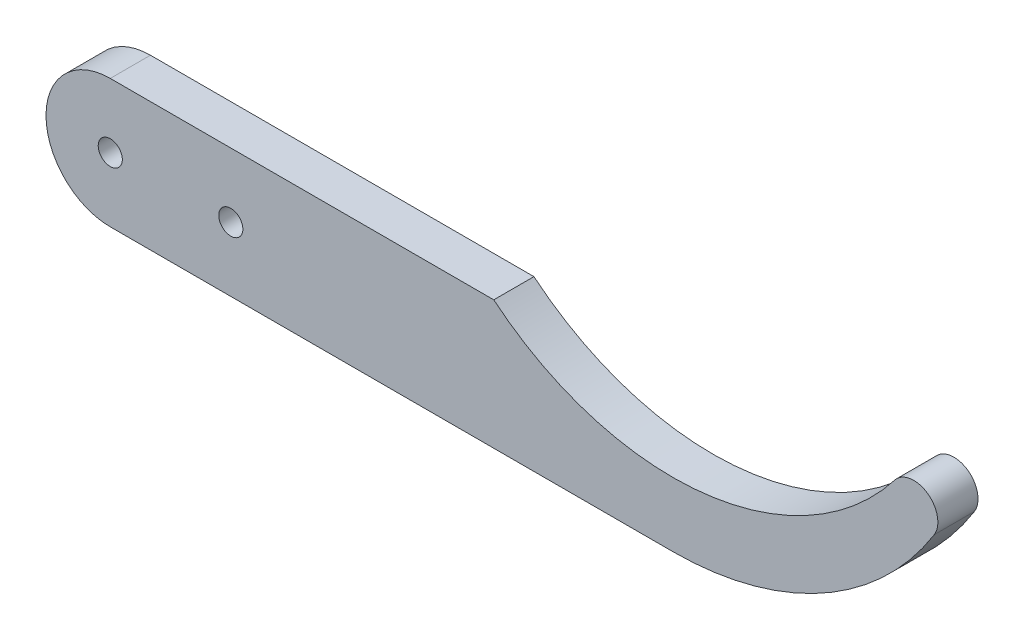
ISO-10303-21;
HEADER;
FILE_DESCRIPTION(('STEP AP214'),'2;1');
FILE_NAME('part.step','',(''),(''),'','','');
FILE_SCHEMA(('AUTOMOTIVE_DESIGN { 1 0 10303 214 1 1 1 1 }'));
ENDSEC;
DATA;
#1=APPLICATION_CONTEXT('core data for automotive mechanical design processes');
#2=APPLICATION_PROTOCOL_DEFINITION('international standard','automotive_design',2000,#1);
#3=PRODUCT_CONTEXT('',#1,'mechanical');
#4=PRODUCT('Part','Part','',(#3));
#5=PRODUCT_RELATED_PRODUCT_CATEGORY('part','',(#4));
#6=PRODUCT_DEFINITION_FORMATION('','',#4);
#7=PRODUCT_DEFINITION_CONTEXT('part definition',#1,'design');
#8=PRODUCT_DEFINITION('design','',#6,#7);
#9=PRODUCT_DEFINITION_SHAPE('','',#8);
#10=(LENGTH_UNIT() NAMED_UNIT(*) SI_UNIT(.MILLI.,.METRE.));
#11=(NAMED_UNIT(*) PLANE_ANGLE_UNIT() SI_UNIT($,.RADIAN.));
#12=(NAMED_UNIT(*) SI_UNIT($,.STERADIAN.) SOLID_ANGLE_UNIT());
#13=UNCERTAINTY_MEASURE_WITH_UNIT(LENGTH_MEASURE(1.E-05),#10,'distance_accuracy_value','');
#14=(GEOMETRIC_REPRESENTATION_CONTEXT(3) GLOBAL_UNCERTAINTY_ASSIGNED_CONTEXT((#13)) GLOBAL_UNIT_ASSIGNED_CONTEXT((#10,
#11,#12)) REPRESENTATION_CONTEXT('',''));
#15=CARTESIAN_POINT('',(0.,0.,0.));
#16=DIRECTION('',(0.,0.,1.));
#17=DIRECTION('',(1.,0.,0.));
#18=AXIS2_PLACEMENT_3D('',#15,#16,#17);
#19=CARTESIAN_POINT('',(-15.,0.,5.));
#20=DIRECTION('',(0.,0.,1.));
#21=DIRECTION('',(1.,0.,0.));
#22=AXIS2_PLACEMENT_3D('',#19,#20,#21);
#23=PLANE('',#22);
#24=CARTESIAN_POINT('',(0.,0.,5.));
#25=DIRECTION('',(0.,0.,1.));
#26=DIRECTION('',(1.,0.,0.));
#27=AXIS2_PLACEMENT_3D('',#24,#25,#26);
#28=CIRCLE('',#27,1.5);
#29=CARTESIAN_POINT('',(1.5,0.,5.));
#30=VERTEX_POINT('',#29);
#31=EDGE_CURVE('E127',#30,#30,#28,.T.);
#32=ORIENTED_EDGE('',*,*,#31,.F.);
#33=EDGE_LOOP('',(#32));
#34=FACE_BOUND('',#33,.T.);
#35=DIRECTION('',(-1.,0.,0.));
#36=VECTOR('',#35,1.);
#37=CARTESIAN_POINT('',(0.,8.,5.));
#38=LINE('',#37,#36);
#39=CARTESIAN_POINT('',(32.7289425486799,8.,5.));
#40=VERTEX_POINT('',#39);
#41=CARTESIAN_POINT('',(-15.,8.,5.));
#42=VERTEX_POINT('',#41);
#43=EDGE_CURVE('E50',#40,#42,#38,.T.);
#44=ORIENTED_EDGE('',*,*,#43,.T.);
#45=CARTESIAN_POINT('',(-15.,0.,5.));
#46=DIRECTION('',(0.,0.,1.));
#47=DIRECTION('',(1.,0.,0.));
#48=AXIS2_PLACEMENT_3D('',#45,#46,#47);
#49=CIRCLE('',#48,8.);
#50=CARTESIAN_POINT('',(-15.,-8.,5.));
#51=VERTEX_POINT('',#50);
#52=EDGE_CURVE('E89',#42,#51,#49,.T.);
#53=ORIENTED_EDGE('',*,*,#52,.T.);
#54=DIRECTION('',(1.,0.,0.));
#55=VECTOR('',#54,1.);
#56=CARTESIAN_POINT('',(0.,-8.,5.));
#57=LINE('',#56,#55);
#58=CARTESIAN_POINT('',(55.,-8.,5.));
#59=VERTEX_POINT('',#58);
#60=EDGE_CURVE('E103',#51,#59,#57,.T.);
#61=ORIENTED_EDGE('',*,*,#60,.T.);
#62=CARTESIAN_POINT('',(55.,30.3226733037957,5.));
#63=DIRECTION('',(0.,0.,1.));
#64=DIRECTION('',(1.,0.,0.));
#65=AXIS2_PLACEMENT_3D('',#62,#63,#64);
#66=CIRCLE('',#65,38.3226733037957);
#67=CARTESIAN_POINT('',(87.5479385216953,10.0925228560754,5.));
#68=VERTEX_POINT('',#67);
#69=EDGE_CURVE('E97',#59,#68,#66,.T.);
#70=ORIENTED_EDGE('',*,*,#69,.T.);
#71=CARTESIAN_POINT('',(85.,11.6761924206188,5.));
#72=DIRECTION('',(0.,0.,1.));
#73=DIRECTION('',(-1.,0.,0.));
#74=AXIS2_PLACEMENT_3D('',#71,#72,#73);
#75=CIRCLE('',#74,3.);
#76=CARTESIAN_POINT('',(82.6315789473684,13.5175456505699,5.));
#77=VERTEX_POINT('',#76);
#78=EDGE_CURVE('E101',#68,#77,#75,.T.);
#79=ORIENTED_EDGE('',*,*,#78,.T.);
#80=CARTESIAN_POINT('',(55.,35.,5.));
#81=DIRECTION('',(0.,0.,-1.));
#82=DIRECTION('',(1.,0.,0.));
#83=AXIS2_PLACEMENT_3D('',#80,#81,#82);
#84=CIRCLE('',#83,35.);
#85=EDGE_CURVE('E117',#77,#40,#84,.T.);
#86=ORIENTED_EDGE('',*,*,#85,.T.);
#87=EDGE_LOOP('',(#44,#53,#61,#70,#79,#86));
#88=FACE_BOUND('',#87,.T.);
#89=CARTESIAN_POINT('',(-15.,0.,5.));
#90=DIRECTION('',(0.,0.,1.));
#91=DIRECTION('',(1.,0.,0.));
#92=AXIS2_PLACEMENT_3D('',#89,#90,#91);
#93=CIRCLE('',#92,1.5);
#94=CARTESIAN_POINT('',(-13.5,0.,5.));
#95=VERTEX_POINT('',#94);
#96=EDGE_CURVE('E173',#95,#95,#93,.T.);
#97=ORIENTED_EDGE('',*,*,#96,.F.);
#98=EDGE_LOOP('',(#97));
#99=FACE_BOUND('',#98,.T.);
#100=ADVANCED_FACE('F33',(#34,#88,#99),#23,.T.);
#101=CARTESIAN_POINT('',(-15.,0.,0.));
#102=DIRECTION('',(0.,0.,1.));
#103=DIRECTION('',(1.,0.,0.));
#104=AXIS2_PLACEMENT_3D('',#101,#102,#103);
#105=PLANE('',#104);
#106=CARTESIAN_POINT('',(0.,0.,0.));
#107=DIRECTION('',(0.,0.,1.));
#108=DIRECTION('',(1.,0.,0.));
#109=AXIS2_PLACEMENT_3D('',#106,#107,#108);
#110=CIRCLE('',#109,1.5);
#111=CARTESIAN_POINT('',(1.5,0.,0.));
#112=VERTEX_POINT('',#111);
#113=EDGE_CURVE('E178',#112,#112,#110,.T.);
#114=ORIENTED_EDGE('',*,*,#113,.T.);
#115=EDGE_LOOP('',(#114));
#116=FACE_BOUND('',#115,.T.);
#117=CARTESIAN_POINT('',(-15.,0.,0.));
#118=DIRECTION('',(0.,0.,1.));
#119=DIRECTION('',(1.,0.,0.));
#120=AXIS2_PLACEMENT_3D('',#117,#118,#119);
#121=CIRCLE('',#120,8.);
#122=CARTESIAN_POINT('',(-15.,8.,0.));
#123=VERTEX_POINT('',#122);
#124=CARTESIAN_POINT('',(-15.,-8.,0.));
#125=VERTEX_POINT('',#124);
#126=EDGE_CURVE('E123',#123,#125,#121,.T.);
#127=ORIENTED_EDGE('',*,*,#126,.F.);
#128=DIRECTION('',(-1.,0.,0.));
#129=VECTOR('',#128,1.);
#130=CARTESIAN_POINT('',(0.,8.,0.));
#131=LINE('',#130,#129);
#132=CARTESIAN_POINT('',(32.7289425486799,8.,0.));
#133=VERTEX_POINT('',#132);
#134=EDGE_CURVE('E81',#133,#123,#131,.T.);
#135=ORIENTED_EDGE('',*,*,#134,.F.);
#136=CARTESIAN_POINT('',(55.,35.,0.));
#137=DIRECTION('',(0.,0.,-1.));
#138=DIRECTION('',(1.,0.,0.));
#139=AXIS2_PLACEMENT_3D('',#136,#137,#138);
#140=CIRCLE('',#139,35.);
#141=CARTESIAN_POINT('',(82.6315789473684,13.5175456505699,0.));
#142=VERTEX_POINT('',#141);
#143=EDGE_CURVE('E131',#142,#133,#140,.T.);
#144=ORIENTED_EDGE('',*,*,#143,.F.);
#145=CARTESIAN_POINT('',(85.,11.6761924206188,0.));
#146=DIRECTION('',(0.,0.,1.));
#147=DIRECTION('',(-1.,0.,0.));
#148=AXIS2_PLACEMENT_3D('',#145,#146,#147);
#149=CIRCLE('',#148,3.);
#150=CARTESIAN_POINT('',(87.5479385216953,10.0925228560754,0.));
#151=VERTEX_POINT('',#150);
#152=EDGE_CURVE('E74',#151,#142,#149,.T.);
#153=ORIENTED_EDGE('',*,*,#152,.F.);
#154=CARTESIAN_POINT('',(55.,30.3226733037957,0.));
#155=DIRECTION('',(0.,0.,1.));
#156=DIRECTION('',(1.,0.,0.));
#157=AXIS2_PLACEMENT_3D('',#154,#155,#156);
#158=CIRCLE('',#157,38.3226733037957);
#159=CARTESIAN_POINT('',(55.,-8.,0.));
#160=VERTEX_POINT('',#159);
#161=EDGE_CURVE('E111',#160,#151,#158,.T.);
#162=ORIENTED_EDGE('',*,*,#161,.F.);
#163=DIRECTION('',(1.,0.,0.));
#164=VECTOR('',#163,1.);
#165=CARTESIAN_POINT('',(0.,-8.,0.));
#166=LINE('',#165,#164);
#167=EDGE_CURVE('E126',#125,#160,#166,.T.);
#168=ORIENTED_EDGE('',*,*,#167,.F.);
#169=EDGE_LOOP('',(#127,#135,#144,#153,#162,#168));
#170=FACE_BOUND('',#169,.T.);
#171=CARTESIAN_POINT('',(-15.,0.,0.));
#172=DIRECTION('',(0.,0.,1.));
#173=DIRECTION('',(1.,0.,0.));
#174=AXIS2_PLACEMENT_3D('',#171,#172,#173);
#175=CIRCLE('',#174,1.5);
#176=CARTESIAN_POINT('',(-13.5,0.,0.));
#177=VERTEX_POINT('',#176);
#178=EDGE_CURVE('E176',#177,#177,#175,.T.);
#179=ORIENTED_EDGE('',*,*,#178,.T.);
#180=EDGE_LOOP('',(#179));
#181=FACE_BOUND('',#180,.T.);
#182=ADVANCED_FACE('F139',(#116,#170,#181),#105,.F.);
#183=CARTESIAN_POINT('',(-15.,0.,5.));
#184=DIRECTION('',(0.,0.,-1.));
#185=DIRECTION('',(-1.,0.,0.));
#186=AXIS2_PLACEMENT_3D('',#183,#184,#185);
#187=CYLINDRICAL_SURFACE('',#186,8.);
#188=ORIENTED_EDGE('',*,*,#126,.T.);
#189=DIRECTION('',(0.,0.,-1.));
#190=VECTOR('',#189,1.);
#191=CARTESIAN_POINT('',(-15.,-8.,5.));
#192=LINE('',#191,#190);
#193=EDGE_CURVE('E42',#51,#125,#192,.T.);
#194=ORIENTED_EDGE('',*,*,#193,.F.);
#195=ORIENTED_EDGE('',*,*,#52,.F.);
#196=DIRECTION('',(0.,0.,-1.));
#197=VECTOR('',#196,1.);
#198=CARTESIAN_POINT('',(-15.,8.,5.));
#199=LINE('',#198,#197);
#200=EDGE_CURVE('E11',#42,#123,#199,.T.);
#201=ORIENTED_EDGE('',*,*,#200,.T.);
#202=EDGE_LOOP('',(#188,#194,#195,#201));
#203=FACE_BOUND('',#202,.T.);
#204=ADVANCED_FACE('F35',(#203),#187,.T.);
#205=CARTESIAN_POINT('',(0.,-8.,5.));
#206=DIRECTION('',(0.,1.,0.));
#207=DIRECTION('',(0.,0.,1.));
#208=AXIS2_PLACEMENT_3D('',#205,#206,#207);
#209=PLANE('',#208);
#210=ORIENTED_EDGE('',*,*,#167,.T.);
#211=DIRECTION('',(0.,0.,-1.));
#212=VECTOR('',#211,1.);
#213=CARTESIAN_POINT('',(55.,-8.,5.));
#214=LINE('',#213,#212);
#215=EDGE_CURVE('E112',#59,#160,#214,.T.);
#216=ORIENTED_EDGE('',*,*,#215,.F.);
#217=ORIENTED_EDGE('',*,*,#60,.F.);
#218=ORIENTED_EDGE('',*,*,#193,.T.);
#219=EDGE_LOOP('',(#210,#216,#217,#218));
#220=FACE_BOUND('',#219,.T.);
#221=ADVANCED_FACE('F138',(#220),#209,.F.);
#222=CARTESIAN_POINT('',(55.,30.3226733037957,5.));
#223=DIRECTION('',(0.,0.,-1.));
#224=DIRECTION('',(-1.,0.,0.));
#225=AXIS2_PLACEMENT_3D('',#222,#223,#224);
#226=CYLINDRICAL_SURFACE('',#225,38.3226733037957);
#227=ORIENTED_EDGE('',*,*,#161,.T.);
#228=DIRECTION('',(0.,0.,-1.));
#229=VECTOR('',#228,1.);
#230=CARTESIAN_POINT('',(87.5479385216953,10.0925228560754,5.));
#231=LINE('',#230,#229);
#232=EDGE_CURVE('E108',#68,#151,#231,.T.);
#233=ORIENTED_EDGE('',*,*,#232,.F.);
#234=ORIENTED_EDGE('',*,*,#69,.F.);
#235=ORIENTED_EDGE('',*,*,#215,.T.);
#236=EDGE_LOOP('',(#227,#233,#234,#235));
#237=FACE_BOUND('',#236,.T.);
#238=ADVANCED_FACE('F109',(#237),#226,.T.);
#239=CARTESIAN_POINT('',(85.,11.6761924206188,5.));
#240=DIRECTION('',(0.,0.,-1.));
#241=DIRECTION('',(-1.,0.,0.));
#242=AXIS2_PLACEMENT_3D('',#239,#240,#241);
#243=CYLINDRICAL_SURFACE('',#242,3.);
#244=ORIENTED_EDGE('',*,*,#152,.T.);
#245=DIRECTION('',(0.,0.,-1.));
#246=VECTOR('',#245,1.);
#247=CARTESIAN_POINT('',(82.6315789473684,13.5175456505699,5.));
#248=LINE('',#247,#246);
#249=EDGE_CURVE('E113',#77,#142,#248,.T.);
#250=ORIENTED_EDGE('',*,*,#249,.F.);
#251=ORIENTED_EDGE('',*,*,#78,.F.);
#252=ORIENTED_EDGE('',*,*,#232,.T.);
#253=EDGE_LOOP('',(#244,#250,#251,#252));
#254=FACE_BOUND('',#253,.T.);
#255=ADVANCED_FACE('F115',(#254),#243,.T.);
#256=CARTESIAN_POINT('',(55.,35.,5.));
#257=DIRECTION('',(0.,0.,-1.));
#258=DIRECTION('',(-1.,0.,0.));
#259=AXIS2_PLACEMENT_3D('',#256,#257,#258);
#260=CYLINDRICAL_SURFACE('',#259,35.);
#261=ORIENTED_EDGE('',*,*,#143,.T.);
#262=DIRECTION('',(0.,0.,-1.));
#263=VECTOR('',#262,1.);
#264=CARTESIAN_POINT('',(32.7289425486799,8.,5.));
#265=LINE('',#264,#263);
#266=EDGE_CURVE('E119',#40,#133,#265,.T.);
#267=ORIENTED_EDGE('',*,*,#266,.F.);
#268=ORIENTED_EDGE('',*,*,#85,.F.);
#269=ORIENTED_EDGE('',*,*,#249,.T.);
#270=EDGE_LOOP('',(#261,#267,#268,#269));
#271=FACE_BOUND('',#270,.T.);
#272=ADVANCED_FACE('F143',(#271),#260,.F.);
#273=CARTESIAN_POINT('',(0.,8.,5.));
#274=DIRECTION('',(0.,-1.,0.));
#275=DIRECTION('',(0.,0.,-1.));
#276=AXIS2_PLACEMENT_3D('',#273,#274,#275);
#277=PLANE('',#276);
#278=ORIENTED_EDGE('',*,*,#134,.T.);
#279=ORIENTED_EDGE('',*,*,#200,.F.);
#280=ORIENTED_EDGE('',*,*,#43,.F.);
#281=ORIENTED_EDGE('',*,*,#266,.T.);
#282=EDGE_LOOP('',(#278,#279,#280,#281));
#283=FACE_BOUND('',#282,.T.);
#284=ADVANCED_FACE('F144',(#283),#277,.F.);
#285=CARTESIAN_POINT('',(0.,0.,5.));
#286=DIRECTION('',(0.,0.,-1.));
#287=DIRECTION('',(-1.,0.,0.));
#288=AXIS2_PLACEMENT_3D('',#285,#286,#287);
#289=CYLINDRICAL_SURFACE('',#288,1.5);
#290=ORIENTED_EDGE('',*,*,#31,.T.);
#291=EDGE_LOOP('',(#290));
#292=FACE_BOUND('',#291,.T.);
#293=ORIENTED_EDGE('',*,*,#113,.F.);
#294=EDGE_LOOP('',(#293));
#295=FACE_BOUND('',#294,.T.);
#296=ADVANCED_FACE('F146',(#292,#295),#289,.F.);
#297=CARTESIAN_POINT('',(-15.,0.,5.));
#298=DIRECTION('',(0.,0.,-1.));
#299=DIRECTION('',(-1.,0.,0.));
#300=AXIS2_PLACEMENT_3D('',#297,#298,#299);
#301=CYLINDRICAL_SURFACE('',#300,1.5);
#302=ORIENTED_EDGE('',*,*,#96,.T.);
#303=EDGE_LOOP('',(#302));
#304=FACE_BOUND('',#303,.T.);
#305=ORIENTED_EDGE('',*,*,#178,.F.);
#306=EDGE_LOOP('',(#305));
#307=FACE_BOUND('',#306,.T.);
#308=ADVANCED_FACE('F152',(#304,#307),#301,.F.);
#309=CLOSED_SHELL('',(#100,#182,#204,#221,#238,#255,#272,#284,#296,#308));
#310=MANIFOLD_SOLID_BREP('B2',#309);
#311=ADVANCED_BREP_SHAPE_REPRESENTATION('',(#18,#310),#14);
#312=SHAPE_DEFINITION_REPRESENTATION(#9,#311);
ENDSEC;
END-ISO-10303-21;
